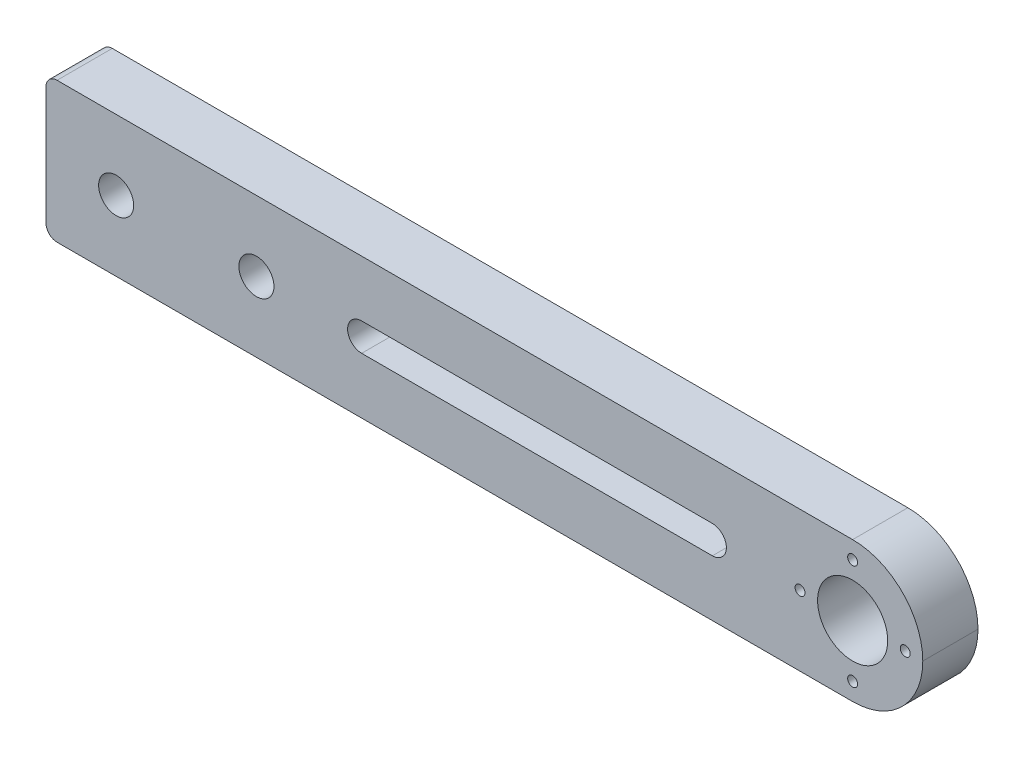
ISO-10303-21;
HEADER;
FILE_DESCRIPTION(('STEP AP214'),'2;1');
FILE_NAME('part.step','',(''),(''),'','','');
FILE_SCHEMA(('AUTOMOTIVE_DESIGN { 1 0 10303 214 1 1 1 1 }'));
ENDSEC;
DATA;
#1=APPLICATION_CONTEXT('core data for automotive mechanical design processes');
#2=APPLICATION_PROTOCOL_DEFINITION('international standard','automotive_design',2000,#1);
#3=PRODUCT_CONTEXT('',#1,'mechanical');
#4=PRODUCT('Part','Part','',(#3));
#5=PRODUCT_RELATED_PRODUCT_CATEGORY('part','',(#4));
#6=PRODUCT_DEFINITION_FORMATION('','',#4);
#7=PRODUCT_DEFINITION_CONTEXT('part definition',#1,'design');
#8=PRODUCT_DEFINITION('design','',#6,#7);
#9=PRODUCT_DEFINITION_SHAPE('','',#8);
#10=(LENGTH_UNIT() NAMED_UNIT(*) SI_UNIT(.MILLI.,.METRE.));
#11=(NAMED_UNIT(*) PLANE_ANGLE_UNIT() SI_UNIT($,.RADIAN.));
#12=(NAMED_UNIT(*) SI_UNIT($,.STERADIAN.) SOLID_ANGLE_UNIT());
#13=UNCERTAINTY_MEASURE_WITH_UNIT(LENGTH_MEASURE(1.E-05),#10,'distance_accuracy_value','');
#14=(GEOMETRIC_REPRESENTATION_CONTEXT(3) GLOBAL_UNCERTAINTY_ASSIGNED_CONTEXT((#13)) GLOBAL_UNIT_ASSIGNED_CONTEXT((#10,
#11,#12)) REPRESENTATION_CONTEXT('',''));
#15=CARTESIAN_POINT('',(0.,0.,0.));
#16=DIRECTION('',(0.,0.,1.));
#17=DIRECTION('',(1.,0.,0.));
#18=AXIS2_PLACEMENT_3D('',#15,#16,#17);
#19=CARTESIAN_POINT('',(0.,0.,10.));
#20=DIRECTION('',(0.,0.,-1.));
#21=DIRECTION('',(-1.,0.,0.));
#22=AXIS2_PLACEMENT_3D('',#19,#20,#21);
#23=PLANE('',#22);
#24=CARTESIAN_POINT('',(-60.3249999999999,0.,10.));
#25=DIRECTION('',(0.,0.,1.));
#26=DIRECTION('',(1.,0.,0.));
#27=AXIS2_PLACEMENT_3D('',#24,#25,#26);
#28=CIRCLE('',#27,3.175);
#29=CARTESIAN_POINT('',(-57.1499999999999,0.,10.));
#30=VERTEX_POINT('',#29);
#31=EDGE_CURVE('E162',#30,#30,#28,.T.);
#32=ORIENTED_EDGE('',*,*,#31,.F.);
#33=EDGE_LOOP('',(#32));
#34=FACE_BOUND('',#33,.T.);
#35=CARTESIAN_POINT('',(73.025,0.,10.));
#36=DIRECTION('',(0.,0.,-1.));
#37=DIRECTION('',(-1.,0.,0.));
#38=AXIS2_PLACEMENT_3D('',#35,#36,#37);
#39=CIRCLE('',#38,12.7);
#40=CARTESIAN_POINT('',(73.025,-12.7,10.));
#41=VERTEX_POINT('',#40);
#42=CARTESIAN_POINT('',(85.7250000000001,0.,10.));
#43=VERTEX_POINT('',#42);
#44=EDGE_CURVE('E49',#41,#43,#39,.F.);
#45=ORIENTED_EDGE('',*,*,#44,.T.);
#46=CARTESIAN_POINT('',(73.025,0.,10.));
#47=DIRECTION('',(0.,0.,-1.));
#48=DIRECTION('',(-1.,0.,0.));
#49=AXIS2_PLACEMENT_3D('',#46,#47,#48);
#50=CIRCLE('',#49,12.7);
#51=CARTESIAN_POINT('',(73.025,12.7,10.));
#52=VERTEX_POINT('',#51);
#53=EDGE_CURVE('E42',#43,#52,#50,.F.);
#54=ORIENTED_EDGE('',*,*,#53,.T.);
#55=DIRECTION('',(-1.,0.,0.));
#56=VECTOR('',#55,1.);
#57=CARTESIAN_POINT('',(85.7250000000001,12.7,10.));
#58=LINE('',#57,#56);
#59=CARTESIAN_POINT('',(-71.0249999999999,12.6999999999999,10.));
#60=VERTEX_POINT('',#59);
#61=EDGE_CURVE('E168',#52,#60,#58,.T.);
#62=ORIENTED_EDGE('',*,*,#61,.T.);
#63=CARTESIAN_POINT('',(-71.0249999999999,10.7,10.));
#64=DIRECTION('',(0.,0.,-1.));
#65=DIRECTION('',(-1.,0.,0.));
#66=AXIS2_PLACEMENT_3D('',#63,#64,#65);
#67=CIRCLE('',#66,2.);
#68=CARTESIAN_POINT('',(-73.0249999999999,10.7,10.));
#69=VERTEX_POINT('',#68);
#70=EDGE_CURVE('E194',#60,#69,#67,.F.);
#71=ORIENTED_EDGE('',*,*,#70,.T.);
#72=DIRECTION('',(0.,-1.,0.));
#73=VECTOR('',#72,1.);
#74=CARTESIAN_POINT('',(-73.0249999999999,-12.7,10.));
#75=LINE('',#74,#73);
#76=CARTESIAN_POINT('',(-73.0249999999999,-10.7,10.));
#77=VERTEX_POINT('',#76);
#78=EDGE_CURVE('E170',#69,#77,#75,.T.);
#79=ORIENTED_EDGE('',*,*,#78,.T.);
#80=CARTESIAN_POINT('',(-71.025,-10.7,10.));
#81=DIRECTION('',(0.,0.,-1.));
#82=DIRECTION('',(-1.,0.,0.));
#83=AXIS2_PLACEMENT_3D('',#80,#81,#82);
#84=CIRCLE('',#83,2.);
#85=CARTESIAN_POINT('',(-71.025,-12.7,10.));
#86=VERTEX_POINT('',#85);
#87=EDGE_CURVE('E196',#77,#86,#84,.F.);
#88=ORIENTED_EDGE('',*,*,#87,.T.);
#89=DIRECTION('',(1.,0.,0.));
#90=VECTOR('',#89,1.);
#91=CARTESIAN_POINT('',(73.025,-12.7,10.));
#92=LINE('',#91,#90);
#93=EDGE_CURVE('E174',#86,#41,#92,.T.);
#94=ORIENTED_EDGE('',*,*,#93,.T.);
#95=EDGE_LOOP('',(#45,#54,#62,#71,#79,#88,#94));
#96=FACE_BOUND('',#95,.T.);
#97=CARTESIAN_POINT('',(-15.875,0.,10.));
#98=DIRECTION('',(0.,0.,1.));
#99=DIRECTION('',(1.,0.,0.));
#100=AXIS2_PLACEMENT_3D('',#97,#98,#99);
#101=CIRCLE('',#100,2.54);
#102=CARTESIAN_POINT('',(-15.875,2.54,10.));
#103=VERTEX_POINT('',#102);
#104=CARTESIAN_POINT('',(-15.875,-2.54,10.));
#105=VERTEX_POINT('',#104);
#106=EDGE_CURVE('E118',#103,#105,#101,.T.);
#107=ORIENTED_EDGE('',*,*,#106,.F.);
#108=DIRECTION('',(-1.,0.,0.));
#109=VECTOR('',#108,1.);
#110=CARTESIAN_POINT('',(-15.875,2.54,10.));
#111=LINE('',#110,#109);
#112=CARTESIAN_POINT('',(47.625,2.54,10.));
#113=VERTEX_POINT('',#112);
#114=EDGE_CURVE('E144',#113,#103,#111,.T.);
#115=ORIENTED_EDGE('',*,*,#114,.F.);
#116=CARTESIAN_POINT('',(47.625,0.,10.));
#117=DIRECTION('',(0.,0.,1.));
#118=DIRECTION('',(1.,0.,0.));
#119=AXIS2_PLACEMENT_3D('',#116,#117,#118);
#120=CIRCLE('',#119,2.54);
#121=CARTESIAN_POINT('',(47.625,-2.54,10.));
#122=VERTEX_POINT('',#121);
#123=EDGE_CURVE('E142',#122,#113,#120,.T.);
#124=ORIENTED_EDGE('',*,*,#123,.F.);
#125=DIRECTION('',(1.,0.,0.));
#126=VECTOR('',#125,1.);
#127=CARTESIAN_POINT('',(-15.875,-2.54,10.));
#128=LINE('',#127,#126);
#129=EDGE_CURVE('E128',#105,#122,#128,.T.);
#130=ORIENTED_EDGE('',*,*,#129,.F.);
#131=EDGE_LOOP('',(#107,#115,#124,#130));
#132=FACE_BOUND('',#131,.T.);
#133=CARTESIAN_POINT('',(73.025,9.52500000000002,10.));
#134=DIRECTION('',(0.,0.,1.));
#135=DIRECTION('',(1.,0.,0.));
#136=AXIS2_PLACEMENT_3D('',#133,#134,#135);
#137=CIRCLE('',#136,0.900000000000004);
#138=CARTESIAN_POINT('',(73.925,9.52500000000002,10.));
#139=VERTEX_POINT('',#138);
#140=EDGE_CURVE('E151',#139,#139,#137,.T.);
#141=ORIENTED_EDGE('',*,*,#140,.F.);
#142=EDGE_LOOP('',(#141));
#143=FACE_BOUND('',#142,.T.);
#144=CARTESIAN_POINT('',(73.025,0.,10.));
#145=DIRECTION('',(0.,0.,1.));
#146=DIRECTION('',(1.,0.,0.));
#147=AXIS2_PLACEMENT_3D('',#144,#145,#146);
#148=CIRCLE('',#147,6.35);
#149=CARTESIAN_POINT('',(79.375,0.,10.));
#150=VERTEX_POINT('',#149);
#151=EDGE_CURVE('E254',#150,#150,#148,.T.);
#152=ORIENTED_EDGE('',*,*,#151,.F.);
#153=EDGE_LOOP('',(#152));
#154=FACE_BOUND('',#153,.T.);
#155=CARTESIAN_POINT('',(73.025,-9.52499999999998,10.));
#156=DIRECTION('',(0.,0.,1.));
#157=DIRECTION('',(1.,0.,0.));
#158=AXIS2_PLACEMENT_3D('',#155,#156,#157);
#159=CIRCLE('',#158,0.900000000000004);
#160=CARTESIAN_POINT('',(73.925,-9.52499999999998,10.));
#161=VERTEX_POINT('',#160);
#162=EDGE_CURVE('E248',#161,#161,#159,.T.);
#163=ORIENTED_EDGE('',*,*,#162,.F.);
#164=EDGE_LOOP('',(#163));
#165=FACE_BOUND('',#164,.T.);
#166=CARTESIAN_POINT('',(63.5,0.,10.));
#167=DIRECTION('',(0.,0.,1.));
#168=DIRECTION('',(1.,0.,0.));
#169=AXIS2_PLACEMENT_3D('',#166,#167,#168);
#170=CIRCLE('',#169,0.900000000000003);
#171=CARTESIAN_POINT('',(64.4,0.,10.));
#172=VERTEX_POINT('',#171);
#173=EDGE_CURVE('E242',#172,#172,#170,.T.);
#174=ORIENTED_EDGE('',*,*,#173,.F.);
#175=EDGE_LOOP('',(#174));
#176=FACE_BOUND('',#175,.T.);
#177=CARTESIAN_POINT('',(82.5500000000001,0.,10.));
#178=DIRECTION('',(0.,0.,1.));
#179=DIRECTION('',(1.,0.,0.));
#180=AXIS2_PLACEMENT_3D('',#177,#178,#179);
#181=CIRCLE('',#180,0.900000000000003);
#182=CARTESIAN_POINT('',(83.45,0.,10.));
#183=VERTEX_POINT('',#182);
#184=EDGE_CURVE('E236',#183,#183,#181,.T.);
#185=ORIENTED_EDGE('',*,*,#184,.F.);
#186=EDGE_LOOP('',(#185));
#187=FACE_BOUND('',#186,.T.);
#188=CARTESIAN_POINT('',(-34.9249999999999,0.,10.));
#189=DIRECTION('',(0.,0.,1.));
#190=DIRECTION('',(1.,0.,0.));
#191=AXIS2_PLACEMENT_3D('',#188,#189,#190);
#192=CIRCLE('',#191,3.175);
#193=CARTESIAN_POINT('',(-31.75,0.,10.));
#194=VERTEX_POINT('',#193);
#195=EDGE_CURVE('E228',#194,#194,#192,.T.);
#196=ORIENTED_EDGE('',*,*,#195,.F.);
#197=EDGE_LOOP('',(#196));
#198=FACE_BOUND('',#197,.T.);
#199=ADVANCED_FACE('F33',(#34,#96,#132,#143,#154,#165,#176,#187,#198),#23,.F.);
#200=CARTESIAN_POINT('',(0.,0.,0.));
#201=DIRECTION('',(0.,0.,-1.));
#202=DIRECTION('',(-1.,0.,0.));
#203=AXIS2_PLACEMENT_3D('',#200,#201,#202);
#204=PLANE('',#203);
#205=CARTESIAN_POINT('',(82.5500000000001,0.,0.));
#206=DIRECTION('',(0.,0.,1.));
#207=DIRECTION('',(1.,0.,0.));
#208=AXIS2_PLACEMENT_3D('',#205,#206,#207);
#209=CIRCLE('',#208,0.900000000000003);
#210=CARTESIAN_POINT('',(83.45,0.,0.));
#211=VERTEX_POINT('',#210);
#212=EDGE_CURVE('E233',#211,#211,#209,.T.);
#213=ORIENTED_EDGE('',*,*,#212,.T.);
#214=EDGE_LOOP('',(#213));
#215=FACE_BOUND('',#214,.T.);
#216=CARTESIAN_POINT('',(73.025,-9.52499999999998,0.));
#217=DIRECTION('',(0.,0.,1.));
#218=DIRECTION('',(1.,0.,0.));
#219=AXIS2_PLACEMENT_3D('',#216,#217,#218);
#220=CIRCLE('',#219,0.900000000000004);
#221=CARTESIAN_POINT('',(73.925,-9.52499999999998,0.));
#222=VERTEX_POINT('',#221);
#223=EDGE_CURVE('E245',#222,#222,#220,.T.);
#224=ORIENTED_EDGE('',*,*,#223,.T.);
#225=EDGE_LOOP('',(#224));
#226=FACE_BOUND('',#225,.T.);
#227=CARTESIAN_POINT('',(73.025,9.52500000000002,0.));
#228=DIRECTION('',(0.,0.,1.));
#229=DIRECTION('',(1.,0.,0.));
#230=AXIS2_PLACEMENT_3D('',#227,#228,#229);
#231=CIRCLE('',#230,0.900000000000004);
#232=CARTESIAN_POINT('',(73.925,9.52500000000002,0.));
#233=VERTEX_POINT('',#232);
#234=EDGE_CURVE('E257',#233,#233,#231,.T.);
#235=ORIENTED_EDGE('',*,*,#234,.T.);
#236=EDGE_LOOP('',(#235));
#237=FACE_BOUND('',#236,.T.);
#238=DIRECTION('',(-1.,0.,0.));
#239=VECTOR('',#238,1.);
#240=CARTESIAN_POINT('',(73.025,12.7,0.));
#241=LINE('',#240,#239);
#242=CARTESIAN_POINT('',(73.025,12.7,0.));
#243=VERTEX_POINT('',#242);
#244=CARTESIAN_POINT('',(-71.025,12.7,0.));
#245=VERTEX_POINT('',#244);
#246=EDGE_CURVE('E165',#243,#245,#241,.T.);
#247=ORIENTED_EDGE('',*,*,#246,.F.);
#248=CARTESIAN_POINT('',(73.025,0.,0.));
#249=DIRECTION('',(0.,0.,-1.));
#250=DIRECTION('',(-1.,0.,0.));
#251=AXIS2_PLACEMENT_3D('',#248,#249,#250);
#252=CIRCLE('',#251,12.7);
#253=CARTESIAN_POINT('',(85.7250000000001,0.,0.));
#254=VERTEX_POINT('',#253);
#255=EDGE_CURVE('E206',#243,#254,#252,.T.);
#256=ORIENTED_EDGE('',*,*,#255,.T.);
#257=CARTESIAN_POINT('',(73.025,0.,0.));
#258=DIRECTION('',(0.,0.,-1.));
#259=DIRECTION('',(-1.,0.,0.));
#260=AXIS2_PLACEMENT_3D('',#257,#258,#259);
#261=CIRCLE('',#260,12.7);
#262=CARTESIAN_POINT('',(73.025,-12.7,0.));
#263=VERTEX_POINT('',#262);
#264=EDGE_CURVE('E204',#254,#263,#261,.T.);
#265=ORIENTED_EDGE('',*,*,#264,.T.);
#266=DIRECTION('',(1.,0.,0.));
#267=VECTOR('',#266,1.);
#268=CARTESIAN_POINT('',(73.025,-12.7,0.));
#269=LINE('',#268,#267);
#270=CARTESIAN_POINT('',(-71.025,-12.7,0.));
#271=VERTEX_POINT('',#270);
#272=EDGE_CURVE('E171',#271,#263,#269,.T.);
#273=ORIENTED_EDGE('',*,*,#272,.F.);
#274=CARTESIAN_POINT('',(-71.025,-10.7,0.));
#275=DIRECTION('',(0.,0.,-1.));
#276=DIRECTION('',(-1.,0.,0.));
#277=AXIS2_PLACEMENT_3D('',#274,#275,#276);
#278=CIRCLE('',#277,2.);
#279=CARTESIAN_POINT('',(-73.0249999999999,-10.7,0.));
#280=VERTEX_POINT('',#279);
#281=EDGE_CURVE('E187',#271,#280,#278,.T.);
#282=ORIENTED_EDGE('',*,*,#281,.T.);
#283=DIRECTION('',(0.,-1.,0.));
#284=VECTOR('',#283,1.);
#285=CARTESIAN_POINT('',(-73.0249999999999,-12.7,0.));
#286=LINE('',#285,#284);
#287=CARTESIAN_POINT('',(-73.0249999999999,10.7,0.));
#288=VERTEX_POINT('',#287);
#289=EDGE_CURVE('E178',#288,#280,#286,.T.);
#290=ORIENTED_EDGE('',*,*,#289,.F.);
#291=CARTESIAN_POINT('',(-71.0249999999999,10.7,0.));
#292=DIRECTION('',(0.,0.,-1.));
#293=DIRECTION('',(-1.,0.,0.));
#294=AXIS2_PLACEMENT_3D('',#291,#292,#293);
#295=CIRCLE('',#294,2.);
#296=EDGE_CURVE('E184',#288,#245,#295,.T.);
#297=ORIENTED_EDGE('',*,*,#296,.T.);
#298=EDGE_LOOP('',(#247,#256,#265,#273,#282,#290,#297));
#299=FACE_BOUND('',#298,.T.);
#300=CARTESIAN_POINT('',(-60.3249999999999,0.,0.));
#301=DIRECTION('',(0.,0.,1.));
#302=DIRECTION('',(1.,0.,0.));
#303=AXIS2_PLACEMENT_3D('',#300,#301,#302);
#304=CIRCLE('',#303,3.175);
#305=CARTESIAN_POINT('',(-57.1499999999999,0.,0.));
#306=VERTEX_POINT('',#305);
#307=EDGE_CURVE('E136',#306,#306,#304,.T.);
#308=ORIENTED_EDGE('',*,*,#307,.T.);
#309=EDGE_LOOP('',(#308));
#310=FACE_BOUND('',#309,.T.);
#311=DIRECTION('',(-1.,0.,0.));
#312=VECTOR('',#311,1.);
#313=CARTESIAN_POINT('',(-15.875,2.54,0.));
#314=LINE('',#313,#312);
#315=CARTESIAN_POINT('',(47.625,2.54,0.));
#316=VERTEX_POINT('',#315);
#317=CARTESIAN_POINT('',(-15.875,2.54,0.));
#318=VERTEX_POINT('',#317);
#319=EDGE_CURVE('E129',#316,#318,#314,.T.);
#320=ORIENTED_EDGE('',*,*,#319,.T.);
#321=CARTESIAN_POINT('',(-15.875,0.,0.));
#322=DIRECTION('',(0.,0.,1.));
#323=DIRECTION('',(1.,0.,0.));
#324=AXIS2_PLACEMENT_3D('',#321,#322,#323);
#325=CIRCLE('',#324,2.54);
#326=CARTESIAN_POINT('',(-15.875,-2.54,0.));
#327=VERTEX_POINT('',#326);
#328=EDGE_CURVE('E149',#318,#327,#325,.T.);
#329=ORIENTED_EDGE('',*,*,#328,.T.);
#330=DIRECTION('',(1.,0.,0.));
#331=VECTOR('',#330,1.);
#332=CARTESIAN_POINT('',(-15.875,-2.54,0.));
#333=LINE('',#332,#331);
#334=CARTESIAN_POINT('',(47.625,-2.54,0.));
#335=VERTEX_POINT('',#334);
#336=EDGE_CURVE('E135',#327,#335,#333,.T.);
#337=ORIENTED_EDGE('',*,*,#336,.T.);
#338=CARTESIAN_POINT('',(47.625,0.,0.));
#339=DIRECTION('',(0.,0.,1.));
#340=DIRECTION('',(1.,0.,0.));
#341=AXIS2_PLACEMENT_3D('',#338,#339,#340);
#342=CIRCLE('',#341,2.54);
#343=EDGE_CURVE('E153',#335,#316,#342,.T.);
#344=ORIENTED_EDGE('',*,*,#343,.T.);
#345=EDGE_LOOP('',(#320,#329,#337,#344));
#346=FACE_BOUND('',#345,.T.);
#347=CARTESIAN_POINT('',(73.025,0.,0.));
#348=DIRECTION('',(0.,0.,1.));
#349=DIRECTION('',(1.,0.,0.));
#350=AXIS2_PLACEMENT_3D('',#347,#348,#349);
#351=CIRCLE('',#350,6.35);
#352=CARTESIAN_POINT('',(79.375,0.,0.));
#353=VERTEX_POINT('',#352);
#354=EDGE_CURVE('E251',#353,#353,#351,.T.);
#355=ORIENTED_EDGE('',*,*,#354,.T.);
#356=EDGE_LOOP('',(#355));
#357=FACE_BOUND('',#356,.T.);
#358=CARTESIAN_POINT('',(63.5,0.,0.));
#359=DIRECTION('',(0.,0.,1.));
#360=DIRECTION('',(1.,0.,0.));
#361=AXIS2_PLACEMENT_3D('',#358,#359,#360);
#362=CIRCLE('',#361,0.900000000000003);
#363=CARTESIAN_POINT('',(64.4,0.,0.));
#364=VERTEX_POINT('',#363);
#365=EDGE_CURVE('E239',#364,#364,#362,.T.);
#366=ORIENTED_EDGE('',*,*,#365,.T.);
#367=EDGE_LOOP('',(#366));
#368=FACE_BOUND('',#367,.T.);
#369=CARTESIAN_POINT('',(-34.9249999999999,0.,0.));
#370=DIRECTION('',(0.,0.,1.));
#371=DIRECTION('',(1.,0.,0.));
#372=AXIS2_PLACEMENT_3D('',#369,#370,#371);
#373=CIRCLE('',#372,3.175);
#374=CARTESIAN_POINT('',(-31.75,0.,0.));
#375=VERTEX_POINT('',#374);
#376=EDGE_CURVE('E226',#375,#375,#373,.T.);
#377=ORIENTED_EDGE('',*,*,#376,.T.);
#378=EDGE_LOOP('',(#377));
#379=FACE_BOUND('',#378,.T.);
#380=ADVANCED_FACE('F222',(#215,#226,#237,#299,#310,#346,#357,#368,#379),#204,.T.);
#381=CARTESIAN_POINT('',(73.025,12.7,10.));
#382=DIRECTION('',(0.,-1.,0.));
#383=DIRECTION('',(1.,0.,0.));
#384=AXIS2_PLACEMENT_3D('',#381,#382,#383);
#385=PLANE('',#384);
#386=ORIENTED_EDGE('',*,*,#61,.F.);
#387=DIRECTION('',(0.,0.,-1.));
#388=VECTOR('',#387,1.);
#389=CARTESIAN_POINT('',(73.025,12.7,10.));
#390=LINE('',#389,#388);
#391=EDGE_CURVE('E201',#52,#243,#390,.T.);
#392=ORIENTED_EDGE('',*,*,#391,.T.);
#393=ORIENTED_EDGE('',*,*,#246,.T.);
#394=DIRECTION('',(0.,0.,-1.));
#395=VECTOR('',#394,1.);
#396=CARTESIAN_POINT('',(-71.025,12.7,10.));
#397=LINE('',#396,#395);
#398=EDGE_CURVE('E198',#245,#60,#397,.F.);
#399=ORIENTED_EDGE('',*,*,#398,.T.);
#400=EDGE_LOOP('',(#386,#392,#393,#399));
#401=FACE_BOUND('',#400,.T.);
#402=ADVANCED_FACE('F215',(#401),#385,.F.);
#403=CARTESIAN_POINT('',(-73.0249999999999,-12.7,10.));
#404=DIRECTION('',(1.,0.,0.));
#405=DIRECTION('',(0.,0.,-1.));
#406=AXIS2_PLACEMENT_3D('',#403,#404,#405);
#407=PLANE('',#406);
#408=ORIENTED_EDGE('',*,*,#289,.T.);
#409=DIRECTION('',(0.,0.,-1.));
#410=VECTOR('',#409,1.);
#411=CARTESIAN_POINT('',(-73.0249999999999,-10.7,10.));
#412=LINE('',#411,#410);
#413=EDGE_CURVE('E192',#280,#77,#412,.F.);
#414=ORIENTED_EDGE('',*,*,#413,.T.);
#415=ORIENTED_EDGE('',*,*,#78,.F.);
#416=DIRECTION('',(0.,0.,-1.));
#417=VECTOR('',#416,1.);
#418=CARTESIAN_POINT('',(-73.0249999999999,10.7,10.));
#419=LINE('',#418,#417);
#420=EDGE_CURVE('E189',#69,#288,#419,.T.);
#421=ORIENTED_EDGE('',*,*,#420,.T.);
#422=EDGE_LOOP('',(#408,#414,#415,#421));
#423=FACE_BOUND('',#422,.T.);
#424=ADVANCED_FACE('F297',(#423),#407,.F.);
#425=CARTESIAN_POINT('',(73.025,-12.7,10.));
#426=DIRECTION('',(0.,1.,0.));
#427=DIRECTION('',(-1.,0.,0.));
#428=AXIS2_PLACEMENT_3D('',#425,#426,#427);
#429=PLANE('',#428);
#430=ORIENTED_EDGE('',*,*,#272,.T.);
#431=DIRECTION('',(0.,0.,-1.));
#432=VECTOR('',#431,1.);
#433=CARTESIAN_POINT('',(73.025,-12.7,10.));
#434=LINE('',#433,#432);
#435=EDGE_CURVE('E11',#263,#41,#434,.F.);
#436=ORIENTED_EDGE('',*,*,#435,.T.);
#437=ORIENTED_EDGE('',*,*,#93,.F.);
#438=DIRECTION('',(0.,0.,-1.));
#439=VECTOR('',#438,1.);
#440=CARTESIAN_POINT('',(-71.025,-12.7,10.));
#441=LINE('',#440,#439);
#442=EDGE_CURVE('E176',#86,#271,#441,.T.);
#443=ORIENTED_EDGE('',*,*,#442,.T.);
#444=EDGE_LOOP('',(#430,#436,#437,#443));
#445=FACE_BOUND('',#444,.T.);
#446=ADVANCED_FACE('F294',(#445),#429,.F.);
#447=CARTESIAN_POINT('',(-60.3249999999999,0.,10.));
#448=DIRECTION('',(0.,0.,-1.));
#449=DIRECTION('',(-1.,0.,0.));
#450=AXIS2_PLACEMENT_3D('',#447,#448,#449);
#451=CYLINDRICAL_SURFACE('',#450,3.175);
#452=ORIENTED_EDGE('',*,*,#31,.T.);
#453=EDGE_LOOP('',(#452));
#454=FACE_BOUND('',#453,.T.);
#455=ORIENTED_EDGE('',*,*,#307,.F.);
#456=EDGE_LOOP('',(#455));
#457=FACE_BOUND('',#456,.T.);
#458=ADVANCED_FACE('F291',(#454,#457),#451,.F.);
#459=CARTESIAN_POINT('',(-15.875,0.,10.));
#460=DIRECTION('',(0.,0.,-1.));
#461=DIRECTION('',(-1.,0.,0.));
#462=AXIS2_PLACEMENT_3D('',#459,#460,#461);
#463=CYLINDRICAL_SURFACE('',#462,2.54);
#464=ORIENTED_EDGE('',*,*,#328,.F.);
#465=DIRECTION('',(0.,0.,-1.));
#466=VECTOR('',#465,1.);
#467=CARTESIAN_POINT('',(-15.875,2.54,10.));
#468=LINE('',#467,#466);
#469=EDGE_CURVE('E124',#103,#318,#468,.T.);
#470=ORIENTED_EDGE('',*,*,#469,.F.);
#471=ORIENTED_EDGE('',*,*,#106,.T.);
#472=DIRECTION('',(0.,0.,-1.));
#473=VECTOR('',#472,1.);
#474=CARTESIAN_POINT('',(-15.875,-2.54,10.));
#475=LINE('',#474,#473);
#476=EDGE_CURVE('E121',#105,#327,#475,.T.);
#477=ORIENTED_EDGE('',*,*,#476,.T.);
#478=EDGE_LOOP('',(#464,#470,#471,#477));
#479=FACE_BOUND('',#478,.T.);
#480=ADVANCED_FACE('F120',(#479),#463,.F.);
#481=CARTESIAN_POINT('',(-15.875,-2.54,10.));
#482=DIRECTION('',(0.,1.,0.));
#483=DIRECTION('',(0.,0.,1.));
#484=AXIS2_PLACEMENT_3D('',#481,#482,#483);
#485=PLANE('',#484);
#486=ORIENTED_EDGE('',*,*,#336,.F.);
#487=ORIENTED_EDGE('',*,*,#476,.F.);
#488=ORIENTED_EDGE('',*,*,#129,.T.);
#489=DIRECTION('',(0.,0.,-1.));
#490=VECTOR('',#489,1.);
#491=CARTESIAN_POINT('',(47.625,-2.54,10.));
#492=LINE('',#491,#490);
#493=EDGE_CURVE('E137',#122,#335,#492,.T.);
#494=ORIENTED_EDGE('',*,*,#493,.T.);
#495=EDGE_LOOP('',(#486,#487,#488,#494));
#496=FACE_BOUND('',#495,.T.);
#497=ADVANCED_FACE('F132',(#496),#485,.T.);
#498=CARTESIAN_POINT('',(47.625,0.,10.));
#499=DIRECTION('',(0.,0.,-1.));
#500=DIRECTION('',(-1.,0.,0.));
#501=AXIS2_PLACEMENT_3D('',#498,#499,#500);
#502=CYLINDRICAL_SURFACE('',#501,2.54);
#503=ORIENTED_EDGE('',*,*,#343,.F.);
#504=ORIENTED_EDGE('',*,*,#493,.F.);
#505=ORIENTED_EDGE('',*,*,#123,.T.);
#506=DIRECTION('',(0.,0.,-1.));
#507=VECTOR('',#506,1.);
#508=CARTESIAN_POINT('',(47.625,2.54,10.));
#509=LINE('',#508,#507);
#510=EDGE_CURVE('E159',#113,#316,#509,.T.);
#511=ORIENTED_EDGE('',*,*,#510,.T.);
#512=EDGE_LOOP('',(#503,#504,#505,#511));
#513=FACE_BOUND('',#512,.T.);
#514=ADVANCED_FACE('F278',(#513),#502,.F.);
#515=CARTESIAN_POINT('',(-15.875,2.54,10.));
#516=DIRECTION('',(0.,-1.,0.));
#517=DIRECTION('',(0.,0.,-1.));
#518=AXIS2_PLACEMENT_3D('',#515,#516,#517);
#519=PLANE('',#518);
#520=ORIENTED_EDGE('',*,*,#319,.F.);
#521=ORIENTED_EDGE('',*,*,#510,.F.);
#522=ORIENTED_EDGE('',*,*,#114,.T.);
#523=ORIENTED_EDGE('',*,*,#469,.T.);
#524=EDGE_LOOP('',(#520,#521,#522,#523));
#525=FACE_BOUND('',#524,.T.);
#526=ADVANCED_FACE('F268',(#525),#519,.T.);
#527=CARTESIAN_POINT('',(73.025,9.52500000000002,10.));
#528=DIRECTION('',(0.,0.,-1.));
#529=DIRECTION('',(-1.,0.,0.));
#530=AXIS2_PLACEMENT_3D('',#527,#528,#529);
#531=CYLINDRICAL_SURFACE('',#530,0.900000000000004);
#532=ORIENTED_EDGE('',*,*,#140,.T.);
#533=EDGE_LOOP('',(#532));
#534=FACE_BOUND('',#533,.T.);
#535=ORIENTED_EDGE('',*,*,#234,.F.);
#536=EDGE_LOOP('',(#535));
#537=FACE_BOUND('',#536,.T.);
#538=ADVANCED_FACE('F265',(#534,#537),#531,.F.);
#539=CARTESIAN_POINT('',(73.025,0.,10.));
#540=DIRECTION('',(0.,0.,-1.));
#541=DIRECTION('',(-1.,0.,0.));
#542=AXIS2_PLACEMENT_3D('',#539,#540,#541);
#543=CYLINDRICAL_SURFACE('',#542,6.35);
#544=ORIENTED_EDGE('',*,*,#151,.T.);
#545=EDGE_LOOP('',(#544));
#546=FACE_BOUND('',#545,.T.);
#547=ORIENTED_EDGE('',*,*,#354,.F.);
#548=EDGE_LOOP('',(#547));
#549=FACE_BOUND('',#548,.T.);
#550=ADVANCED_FACE('F267',(#546,#549),#543,.F.);
#551=CARTESIAN_POINT('',(73.025,-9.52499999999998,10.));
#552=DIRECTION('',(0.,0.,-1.));
#553=DIRECTION('',(-1.,0.,0.));
#554=AXIS2_PLACEMENT_3D('',#551,#552,#553);
#555=CYLINDRICAL_SURFACE('',#554,0.900000000000004);
#556=ORIENTED_EDGE('',*,*,#162,.T.);
#557=EDGE_LOOP('',(#556));
#558=FACE_BOUND('',#557,.T.);
#559=ORIENTED_EDGE('',*,*,#223,.F.);
#560=EDGE_LOOP('',(#559));
#561=FACE_BOUND('',#560,.T.);
#562=ADVANCED_FACE('F275',(#558,#561),#555,.F.);
#563=CARTESIAN_POINT('',(63.5,0.,10.));
#564=DIRECTION('',(0.,0.,-1.));
#565=DIRECTION('',(-1.,0.,0.));
#566=AXIS2_PLACEMENT_3D('',#563,#564,#565);
#567=CYLINDRICAL_SURFACE('',#566,0.900000000000003);
#568=ORIENTED_EDGE('',*,*,#173,.T.);
#569=EDGE_LOOP('',(#568));
#570=FACE_BOUND('',#569,.T.);
#571=ORIENTED_EDGE('',*,*,#365,.F.);
#572=EDGE_LOOP('',(#571));
#573=FACE_BOUND('',#572,.T.);
#574=ADVANCED_FACE('F341',(#570,#573),#567,.F.);
#575=CARTESIAN_POINT('',(82.5500000000001,0.,10.));
#576=DIRECTION('',(0.,0.,-1.));
#577=DIRECTION('',(-1.,0.,0.));
#578=AXIS2_PLACEMENT_3D('',#575,#576,#577);
#579=CYLINDRICAL_SURFACE('',#578,0.900000000000003);
#580=ORIENTED_EDGE('',*,*,#184,.T.);
#581=EDGE_LOOP('',(#580));
#582=FACE_BOUND('',#581,.T.);
#583=ORIENTED_EDGE('',*,*,#212,.F.);
#584=EDGE_LOOP('',(#583));
#585=FACE_BOUND('',#584,.T.);
#586=ADVANCED_FACE('F333',(#582,#585),#579,.F.);
#587=CARTESIAN_POINT('',(-34.9249999999999,0.,10.));
#588=DIRECTION('',(0.,0.,-1.));
#589=DIRECTION('',(-1.,0.,0.));
#590=AXIS2_PLACEMENT_3D('',#587,#588,#589);
#591=CYLINDRICAL_SURFACE('',#590,3.175);
#592=ORIENTED_EDGE('',*,*,#195,.T.);
#593=EDGE_LOOP('',(#592));
#594=FACE_BOUND('',#593,.T.);
#595=ORIENTED_EDGE('',*,*,#376,.F.);
#596=EDGE_LOOP('',(#595));
#597=FACE_BOUND('',#596,.T.);
#598=ADVANCED_FACE('F307',(#594,#597),#591,.F.);
#599=CARTESIAN_POINT('',(-71.025,-10.7,10.));
#600=DIRECTION('',(0.,0.,-1.));
#601=DIRECTION('',(-1.,0.,0.));
#602=AXIS2_PLACEMENT_3D('',#599,#600,#601);
#603=CYLINDRICAL_SURFACE('',#602,2.);
#604=ORIENTED_EDGE('',*,*,#87,.F.);
#605=ORIENTED_EDGE('',*,*,#413,.F.);
#606=ORIENTED_EDGE('',*,*,#281,.F.);
#607=ORIENTED_EDGE('',*,*,#442,.F.);
#608=EDGE_LOOP('',(#604,#605,#606,#607));
#609=FACE_BOUND('',#608,.T.);
#610=ADVANCED_FACE('F303',(#609),#603,.T.);
#611=CARTESIAN_POINT('',(-71.0249999999999,10.7,10.));
#612=DIRECTION('',(0.,0.,-1.));
#613=DIRECTION('',(-1.,0.,0.));
#614=AXIS2_PLACEMENT_3D('',#611,#612,#613);
#615=CYLINDRICAL_SURFACE('',#614,2.);
#616=ORIENTED_EDGE('',*,*,#70,.F.);
#617=ORIENTED_EDGE('',*,*,#398,.F.);
#618=ORIENTED_EDGE('',*,*,#296,.F.);
#619=ORIENTED_EDGE('',*,*,#420,.F.);
#620=EDGE_LOOP('',(#616,#617,#618,#619));
#621=FACE_BOUND('',#620,.T.);
#622=ADVANCED_FACE('F306',(#621),#615,.T.);
#623=CARTESIAN_POINT('',(73.025,0.,10.));
#624=DIRECTION('',(0.,0.,-1.));
#625=DIRECTION('',(-1.,0.,0.));
#626=AXIS2_PLACEMENT_3D('',#623,#624,#625);
#627=CYLINDRICAL_SURFACE('',#626,12.7);
#628=DIRECTION('',(0.,0.,-1.));
#629=VECTOR('',#628,1.);
#630=CARTESIAN_POINT('',(85.7250000000001,0.,10.));
#631=LINE('',#630,#629);
#632=EDGE_CURVE('E37',#43,#254,#631,.T.);
#633=ORIENTED_EDGE('',*,*,#632,.F.);
#634=ORIENTED_EDGE('',*,*,#44,.F.);
#635=ORIENTED_EDGE('',*,*,#435,.F.);
#636=ORIENTED_EDGE('',*,*,#264,.F.);
#637=EDGE_LOOP('',(#633,#634,#635,#636));
#638=FACE_BOUND('',#637,.T.);
#639=ADVANCED_FACE('F35',(#638),#627,.T.);
#640=CARTESIAN_POINT('',(73.025,0.,10.));
#641=DIRECTION('',(0.,0.,-1.));
#642=DIRECTION('',(-1.,0.,0.));
#643=AXIS2_PLACEMENT_3D('',#640,#641,#642);
#644=CYLINDRICAL_SURFACE('',#643,12.7);
#645=ORIENTED_EDGE('',*,*,#53,.F.);
#646=ORIENTED_EDGE('',*,*,#632,.T.);
#647=ORIENTED_EDGE('',*,*,#255,.F.);
#648=ORIENTED_EDGE('',*,*,#391,.F.);
#649=EDGE_LOOP('',(#645,#646,#647,#648));
#650=FACE_BOUND('',#649,.T.);
#651=ADVANCED_FACE('F219',(#650),#644,.T.);
#652=CLOSED_SHELL('',(#199,#380,#402,#424,#446,#458,#480,#497,#514,#526,#538,#550,#562,#574,
#586,#598,#610,#622,#639,#651));
#653=MANIFOLD_SOLID_BREP('B2',#652);
#654=ADVANCED_BREP_SHAPE_REPRESENTATION('',(#18,#653),#14);
#655=SHAPE_DEFINITION_REPRESENTATION(#9,#654);
ENDSEC;
END-ISO-10303-21;
